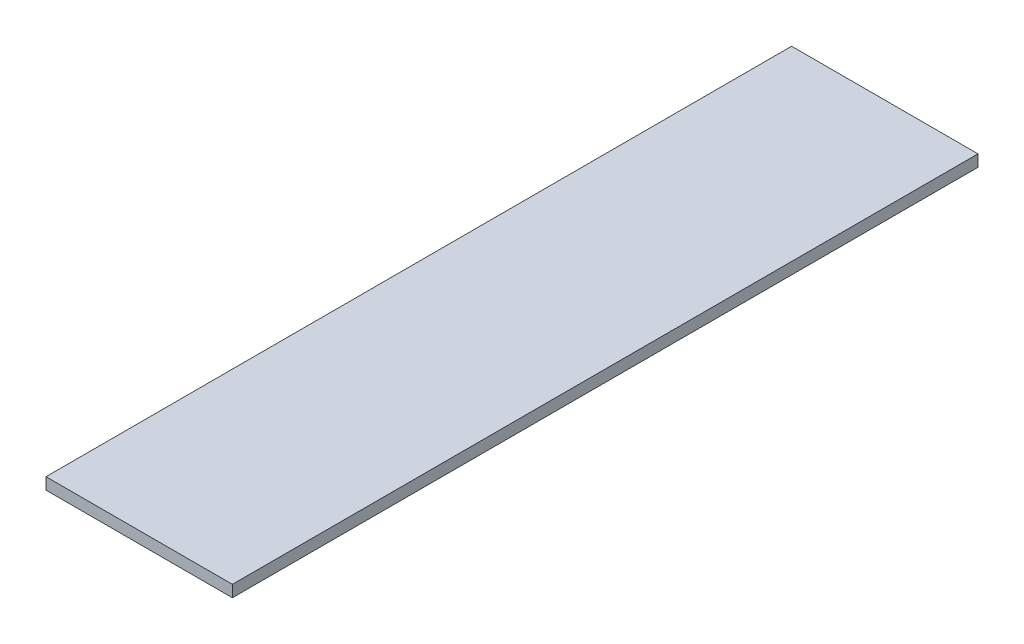
ISO-10303-21;
HEADER;
FILE_DESCRIPTION(('STEP AP214'),'2;1');
FILE_NAME('part.step','',(''),(''),'','','');
FILE_SCHEMA(('AUTOMOTIVE_DESIGN { 1 0 10303 214 1 1 1 1 }'));
ENDSEC;
DATA;
#1=APPLICATION_CONTEXT('core data for automotive mechanical design processes');
#2=APPLICATION_PROTOCOL_DEFINITION('international standard','automotive_design',2000,#1);
#3=PRODUCT_CONTEXT('',#1,'mechanical');
#4=PRODUCT('Part','Part','',(#3));
#5=PRODUCT_RELATED_PRODUCT_CATEGORY('part','',(#4));
#6=PRODUCT_DEFINITION_FORMATION('','',#4);
#7=PRODUCT_DEFINITION_CONTEXT('part definition',#1,'design');
#8=PRODUCT_DEFINITION('design','',#6,#7);
#9=PRODUCT_DEFINITION_SHAPE('','',#8);
#10=(LENGTH_UNIT() NAMED_UNIT(*) SI_UNIT(.MILLI.,.METRE.));
#11=(NAMED_UNIT(*) PLANE_ANGLE_UNIT() SI_UNIT($,.RADIAN.));
#12=(NAMED_UNIT(*) SI_UNIT($,.STERADIAN.) SOLID_ANGLE_UNIT());
#13=UNCERTAINTY_MEASURE_WITH_UNIT(LENGTH_MEASURE(1.E-05),#10,'distance_accuracy_value','');
#14=(GEOMETRIC_REPRESENTATION_CONTEXT(3) GLOBAL_UNCERTAINTY_ASSIGNED_CONTEXT((#13)) GLOBAL_UNIT_ASSIGNED_CONTEXT((#10,
#11,#12)) REPRESENTATION_CONTEXT('',''));
#15=CARTESIAN_POINT('',(0.,0.,0.));
#16=DIRECTION('',(0.,0.,1.));
#17=DIRECTION('',(1.,0.,0.));
#18=AXIS2_PLACEMENT_3D('',#15,#16,#17);
#19=CARTESIAN_POINT('',(0.,3.175,0.));
#20=DIRECTION('',(1.,0.,0.));
#21=DIRECTION('',(0.,0.,-1.));
#22=AXIS2_PLACEMENT_3D('',#19,#20,#21);
#23=PLANE('',#22);
#24=DIRECTION('',(0.,0.,1.));
#25=VECTOR('',#24,1.);
#26=CARTESIAN_POINT('',(0.,0.,0.));
#27=LINE('',#26,#25);
#28=CARTESIAN_POINT('',(0.,0.,-203.2));
#29=VERTEX_POINT('',#28);
#30=CARTESIAN_POINT('',(0.,0.,0.));
#31=VERTEX_POINT('',#30);
#32=EDGE_CURVE('E95',#29,#31,#27,.T.);
#33=ORIENTED_EDGE('',*,*,#32,.T.);
#34=DIRECTION('',(0.,-1.,0.));
#35=VECTOR('',#34,1.);
#36=CARTESIAN_POINT('',(0.,3.175,0.));
#37=LINE('',#36,#35);
#38=CARTESIAN_POINT('',(0.,3.175,0.));
#39=VERTEX_POINT('',#38);
#40=EDGE_CURVE('E11',#39,#31,#37,.T.);
#41=ORIENTED_EDGE('',*,*,#40,.F.);
#42=DIRECTION('',(0.,0.,1.));
#43=VECTOR('',#42,1.);
#44=CARTESIAN_POINT('',(0.,3.175,0.));
#45=LINE('',#44,#43);
#46=CARTESIAN_POINT('',(0.,3.175,-203.2));
#47=VERTEX_POINT('',#46);
#48=EDGE_CURVE('E83',#47,#39,#45,.T.);
#49=ORIENTED_EDGE('',*,*,#48,.F.);
#50=DIRECTION('',(0.,-1.,0.));
#51=VECTOR('',#50,1.);
#52=CARTESIAN_POINT('',(0.,3.175,-203.2));
#53=LINE('',#52,#51);
#54=EDGE_CURVE('E91',#47,#29,#53,.T.);
#55=ORIENTED_EDGE('',*,*,#54,.T.);
#56=EDGE_LOOP('',(#33,#41,#49,#55));
#57=FACE_BOUND('',#56,.T.);
#58=ADVANCED_FACE('F32',(#57),#23,.F.);
#59=CARTESIAN_POINT('',(0.,3.175,0.));
#60=DIRECTION('',(0.,0.,-1.));
#61=DIRECTION('',(-1.,0.,0.));
#62=AXIS2_PLACEMENT_3D('',#59,#60,#61);
#63=PLANE('',#62);
#64=DIRECTION('',(1.,0.,0.));
#65=VECTOR('',#64,1.);
#66=CARTESIAN_POINT('',(0.,0.,0.));
#67=LINE('',#66,#65);
#68=CARTESIAN_POINT('',(50.8,0.,0.));
#69=VERTEX_POINT('',#68);
#70=EDGE_CURVE('E87',#31,#69,#67,.T.);
#71=ORIENTED_EDGE('',*,*,#70,.T.);
#72=DIRECTION('',(0.,-1.,0.));
#73=VECTOR('',#72,1.);
#74=CARTESIAN_POINT('',(50.8,3.175,0.));
#75=LINE('',#74,#73);
#76=CARTESIAN_POINT('',(50.8,3.175,0.));
#77=VERTEX_POINT('',#76);
#78=EDGE_CURVE('E40',#77,#69,#75,.T.);
#79=ORIENTED_EDGE('',*,*,#78,.F.);
#80=DIRECTION('',(1.,0.,0.));
#81=VECTOR('',#80,1.);
#82=CARTESIAN_POINT('',(0.,3.175,0.));
#83=LINE('',#82,#81);
#84=EDGE_CURVE('E78',#39,#77,#83,.T.);
#85=ORIENTED_EDGE('',*,*,#84,.F.);
#86=ORIENTED_EDGE('',*,*,#40,.T.);
#87=EDGE_LOOP('',(#71,#79,#85,#86));
#88=FACE_BOUND('',#87,.T.);
#89=ADVANCED_FACE('F86',(#88),#63,.F.);
#90=CARTESIAN_POINT('',(50.8,3.175,0.));
#91=DIRECTION('',(-1.,0.,0.));
#92=DIRECTION('',(0.,0.,1.));
#93=AXIS2_PLACEMENT_3D('',#90,#91,#92);
#94=PLANE('',#93);
#95=DIRECTION('',(0.,0.,-1.));
#96=VECTOR('',#95,1.);
#97=CARTESIAN_POINT('',(50.8,0.,0.));
#98=LINE('',#97,#96);
#99=CARTESIAN_POINT('',(50.8,0.,-203.2));
#100=VERTEX_POINT('',#99);
#101=EDGE_CURVE('E65',#69,#100,#98,.T.);
#102=ORIENTED_EDGE('',*,*,#101,.T.);
#103=DIRECTION('',(0.,-1.,0.));
#104=VECTOR('',#103,1.);
#105=CARTESIAN_POINT('',(50.8,3.175,-203.2));
#106=LINE('',#105,#104);
#107=CARTESIAN_POINT('',(50.8,3.175,-203.2));
#108=VERTEX_POINT('',#107);
#109=EDGE_CURVE('E88',#108,#100,#106,.T.);
#110=ORIENTED_EDGE('',*,*,#109,.F.);
#111=DIRECTION('',(0.,0.,-1.));
#112=VECTOR('',#111,1.);
#113=CARTESIAN_POINT('',(50.8,3.175,0.));
#114=LINE('',#113,#112);
#115=EDGE_CURVE('E81',#77,#108,#114,.T.);
#116=ORIENTED_EDGE('',*,*,#115,.F.);
#117=ORIENTED_EDGE('',*,*,#78,.T.);
#118=EDGE_LOOP('',(#102,#110,#116,#117));
#119=FACE_BOUND('',#118,.T.);
#120=ADVANCED_FACE('F89',(#119),#94,.F.);
#121=CARTESIAN_POINT('',(0.,3.175,-203.2));
#122=DIRECTION('',(0.,0.,1.));
#123=DIRECTION('',(1.,0.,0.));
#124=AXIS2_PLACEMENT_3D('',#121,#122,#123);
#125=PLANE('',#124);
#126=DIRECTION('',(-1.,0.,0.));
#127=VECTOR('',#126,1.);
#128=CARTESIAN_POINT('',(0.,0.,-203.2));
#129=LINE('',#128,#127);
#130=EDGE_CURVE('E71',#100,#29,#129,.T.);
#131=ORIENTED_EDGE('',*,*,#130,.T.);
#132=ORIENTED_EDGE('',*,*,#54,.F.);
#133=DIRECTION('',(-1.,0.,0.));
#134=VECTOR('',#133,1.);
#135=CARTESIAN_POINT('',(0.,3.175,-203.2));
#136=LINE('',#135,#134);
#137=EDGE_CURVE('E48',#108,#47,#136,.T.);
#138=ORIENTED_EDGE('',*,*,#137,.F.);
#139=ORIENTED_EDGE('',*,*,#109,.T.);
#140=EDGE_LOOP('',(#131,#132,#138,#139));
#141=FACE_BOUND('',#140,.T.);
#142=ADVANCED_FACE('F102',(#141),#125,.F.);
#143=CARTESIAN_POINT('',(0.,3.175,0.));
#144=DIRECTION('',(0.,-1.,0.));
#145=DIRECTION('',(0.,0.,-1.));
#146=AXIS2_PLACEMENT_3D('',#143,#144,#145);
#147=PLANE('',#146);
#148=ORIENTED_EDGE('',*,*,#48,.T.);
#149=ORIENTED_EDGE('',*,*,#84,.T.);
#150=ORIENTED_EDGE('',*,*,#115,.T.);
#151=ORIENTED_EDGE('',*,*,#137,.T.);
#152=EDGE_LOOP('',(#148,#149,#150,#151));
#153=FACE_BOUND('',#152,.T.);
#154=ADVANCED_FACE('F79',(#153),#147,.F.);
#155=CARTESIAN_POINT('',(0.,0.,0.));
#156=DIRECTION('',(0.,-1.,0.));
#157=DIRECTION('',(0.,0.,-1.));
#158=AXIS2_PLACEMENT_3D('',#155,#156,#157);
#159=PLANE('',#158);
#160=ORIENTED_EDGE('',*,*,#32,.F.);
#161=ORIENTED_EDGE('',*,*,#130,.F.);
#162=ORIENTED_EDGE('',*,*,#101,.F.);
#163=ORIENTED_EDGE('',*,*,#70,.F.);
#164=EDGE_LOOP('',(#160,#161,#162,#163));
#165=FACE_BOUND('',#164,.T.);
#166=ADVANCED_FACE('F105',(#165),#159,.T.);
#167=CLOSED_SHELL('',(#58,#89,#120,#142,#154,#166));
#168=MANIFOLD_SOLID_BREP('B2',#167);
#169=ADVANCED_BREP_SHAPE_REPRESENTATION('',(#18,#168),#14);
#170=SHAPE_DEFINITION_REPRESENTATION(#9,#169);
ENDSEC;
END-ISO-10303-21;
